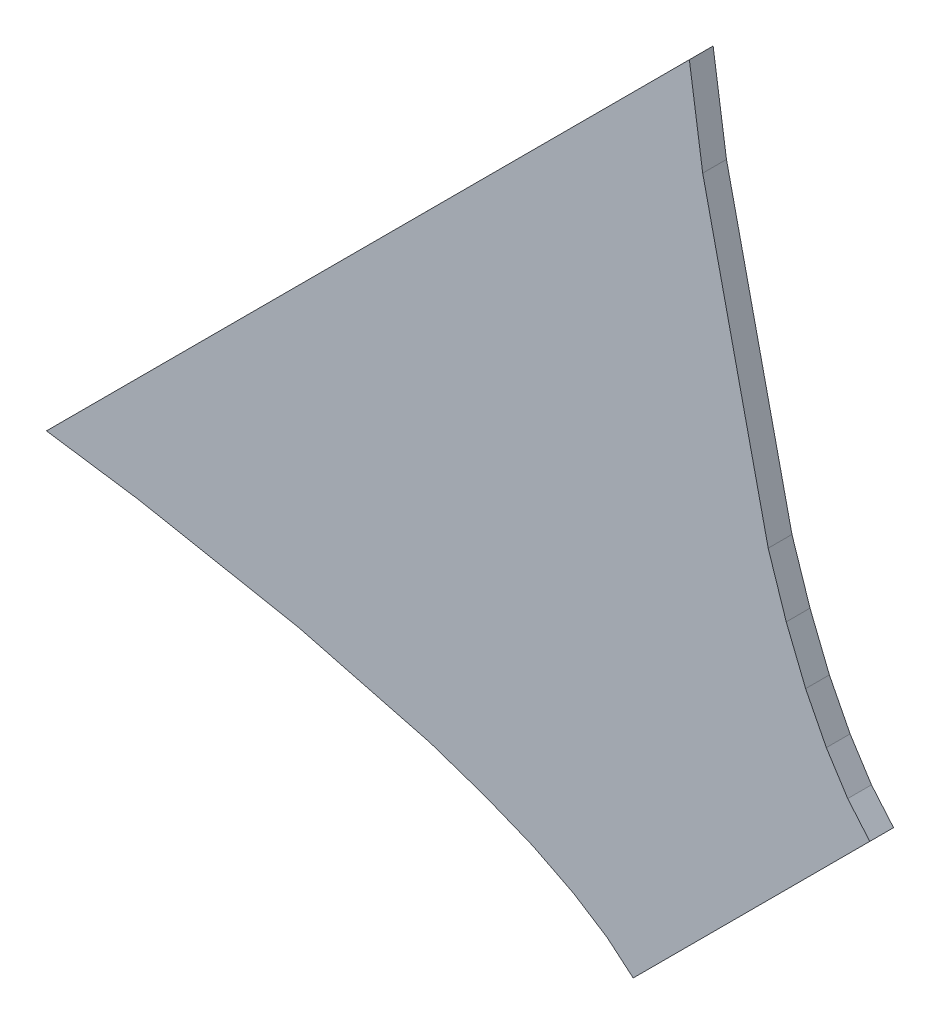
ISO-10303-21;
HEADER;
FILE_DESCRIPTION(('STEP AP214'),'2;1');
FILE_NAME('part.step','',(''),(''),'','','');
FILE_SCHEMA(('AUTOMOTIVE_DESIGN { 1 0 10303 214 1 1 1 1 }'));
ENDSEC;
DATA;
#1=APPLICATION_CONTEXT('core data for automotive mechanical design processes');
#2=APPLICATION_PROTOCOL_DEFINITION('international standard','automotive_design',2000,#1);
#3=PRODUCT_CONTEXT('',#1,'mechanical');
#4=PRODUCT('Part','Part','',(#3));
#5=PRODUCT_RELATED_PRODUCT_CATEGORY('part','',(#4));
#6=PRODUCT_DEFINITION_FORMATION('','',#4);
#7=PRODUCT_DEFINITION_CONTEXT('part definition',#1,'design');
#8=PRODUCT_DEFINITION('design','',#6,#7);
#9=PRODUCT_DEFINITION_SHAPE('','',#8);
#10=(LENGTH_UNIT() NAMED_UNIT(*) SI_UNIT(.MILLI.,.METRE.));
#11=(NAMED_UNIT(*) PLANE_ANGLE_UNIT() SI_UNIT($,.RADIAN.));
#12=(NAMED_UNIT(*) SI_UNIT($,.STERADIAN.) SOLID_ANGLE_UNIT());
#13=UNCERTAINTY_MEASURE_WITH_UNIT(LENGTH_MEASURE(1.E-05),#10,'distance_accuracy_value','');
#14=(GEOMETRIC_REPRESENTATION_CONTEXT(3) GLOBAL_UNCERTAINTY_ASSIGNED_CONTEXT((#13)) GLOBAL_UNIT_ASSIGNED_CONTEXT((#10,
#11,#12)) REPRESENTATION_CONTEXT('',''));
#15=CARTESIAN_POINT('',(0.,0.,0.));
#16=DIRECTION('',(0.,0.,1.));
#17=DIRECTION('',(1.,0.,0.));
#18=AXIS2_PLACEMENT_3D('',#15,#16,#17);
#19=CARTESIAN_POINT('',(86.8219985961914,103.512001037598,0.));
#20=DIRECTION('',(-0.763425936268127,-0.645895378395862,0.));
#21=DIRECTION('',(-0.645895378395862,0.763425936268127,0.));
#22=AXIS2_PLACEMENT_3D('',#19,#20,#21);
#23=PLANE('',#22);
#24=DIRECTION('',(-0.645895378395862,0.763425936268127,0.));
#25=VECTOR('',#24,1.);
#26=CARTESIAN_POINT('',(86.8219985961914,103.512001037598,0.03556));
#27=LINE('',#26,#25);
#28=CARTESIAN_POINT('',(86.8219985961914,103.512001037598,0.03556));
#29=VERTEX_POINT('',#28);
#30=CARTESIAN_POINT('',(86.7890014648438,103.551002502441,0.03556));
#31=VERTEX_POINT('',#30);
#32=EDGE_CURVE('E11',#29,#31,#27,.T.);
#33=ORIENTED_EDGE('',*,*,#32,.F.);
#34=DIRECTION('',(0.,0.,1.));
#35=VECTOR('',#34,1.);
#36=CARTESIAN_POINT('',(86.8219985961914,103.512001037598,0.));
#37=LINE('',#36,#35);
#38=CARTESIAN_POINT('',(86.8219985961914,103.512001037598,0.));
#39=VERTEX_POINT('',#38);
#40=EDGE_CURVE('E24',#39,#29,#37,.T.);
#41=ORIENTED_EDGE('',*,*,#40,.F.);
#42=DIRECTION('',(-0.645895378395862,0.763425936268127,0.));
#43=VECTOR('',#42,1.);
#44=CARTESIAN_POINT('',(86.8219985961914,103.512001037598,0.));
#45=LINE('',#44,#43);
#46=CARTESIAN_POINT('',(86.7890014648438,103.551002502441,0.));
#47=VERTEX_POINT('',#46);
#48=EDGE_CURVE('E154',#39,#47,#45,.T.);
#49=ORIENTED_EDGE('',*,*,#48,.T.);
#50=DIRECTION('',(0.,0.,1.));
#51=VECTOR('',#50,1.);
#52=CARTESIAN_POINT('',(86.7890014648438,103.551002502441,0.));
#53=LINE('',#52,#51);
#54=EDGE_CURVE('E37',#47,#31,#53,.T.);
#55=ORIENTED_EDGE('',*,*,#54,.T.);
#56=EDGE_LOOP('',(#33,#41,#49,#55));
#57=FACE_BOUND('',#56,.T.);
#58=ADVANCED_FACE('F17',(#57),#23,.F.);
#59=CARTESIAN_POINT('',(86.7890014648438,103.551002502441,0.));
#60=DIRECTION('',(-0.842266732063425,-0.539060991038304,0.));
#61=DIRECTION('',(-0.539060991038304,0.842266732063425,0.));
#62=AXIS2_PLACEMENT_3D('',#59,#60,#61);
#63=PLANE('',#62);
#64=DIRECTION('',(-0.539060991038304,0.842266732063425,0.));
#65=VECTOR('',#64,1.);
#66=CARTESIAN_POINT('',(86.7890014648438,103.551002502441,0.03556));
#67=LINE('',#66,#65);
#68=CARTESIAN_POINT('',(86.7570037841797,103.600997924805,0.03556));
#69=VERTEX_POINT('',#68);
#70=EDGE_CURVE('E266',#31,#69,#67,.T.);
#71=ORIENTED_EDGE('',*,*,#70,.F.);
#72=ORIENTED_EDGE('',*,*,#54,.F.);
#73=DIRECTION('',(-0.539060991038304,0.842266732063425,0.));
#74=VECTOR('',#73,1.);
#75=CARTESIAN_POINT('',(86.7890014648438,103.551002502441,0.));
#76=LINE('',#75,#74);
#77=CARTESIAN_POINT('',(86.7570037841797,103.600997924805,0.));
#78=VERTEX_POINT('',#77);
#79=EDGE_CURVE('E263',#47,#78,#76,.T.);
#80=ORIENTED_EDGE('',*,*,#79,.T.);
#81=DIRECTION('',(0.,0.,1.));
#82=VECTOR('',#81,1.);
#83=CARTESIAN_POINT('',(86.7570037841797,103.600997924805,0.));
#84=LINE('',#83,#82);
#85=EDGE_CURVE('E261',#78,#69,#84,.T.);
#86=ORIENTED_EDGE('',*,*,#85,.T.);
#87=EDGE_LOOP('',(#71,#72,#80,#86));
#88=FACE_BOUND('',#87,.T.);
#89=ADVANCED_FACE('F274',(#88),#63,.F.);
#90=CARTESIAN_POINT('',(86.7570037841797,103.600997924805,0.));
#91=DIRECTION('',(-0.891464515087976,-0.453090518924154,0.));
#92=DIRECTION('',(-0.453090518924154,0.891464515087976,0.));
#93=AXIS2_PLACEMENT_3D('',#90,#91,#92);
#94=PLANE('',#93);
#95=DIRECTION('',(-0.453090518924154,0.891464515087976,0.));
#96=VECTOR('',#95,1.);
#97=CARTESIAN_POINT('',(86.7570037841797,103.600997924805,0.03556));
#98=LINE('',#97,#96);
#99=CARTESIAN_POINT('',(86.7259979248047,103.662002563477,0.03556));
#100=VERTEX_POINT('',#99);
#101=EDGE_CURVE('E258',#69,#100,#98,.T.);
#102=ORIENTED_EDGE('',*,*,#101,.F.);
#103=ORIENTED_EDGE('',*,*,#85,.F.);
#104=DIRECTION('',(-0.453090518924154,0.891464515087976,0.));
#105=VECTOR('',#104,1.);
#106=CARTESIAN_POINT('',(86.7570037841797,103.600997924805,0.));
#107=LINE('',#106,#105);
#108=CARTESIAN_POINT('',(86.7259979248047,103.662002563477,0.));
#109=VERTEX_POINT('',#108);
#110=EDGE_CURVE('E255',#78,#109,#107,.T.);
#111=ORIENTED_EDGE('',*,*,#110,.T.);
#112=DIRECTION('',(0.,0.,1.));
#113=VECTOR('',#112,1.);
#114=CARTESIAN_POINT('',(86.7259979248047,103.662002563477,0.));
#115=LINE('',#114,#113);
#116=EDGE_CURVE('E253',#109,#100,#115,.T.);
#117=ORIENTED_EDGE('',*,*,#116,.T.);
#118=EDGE_LOOP('',(#102,#103,#111,#117));
#119=FACE_BOUND('',#118,.T.);
#120=ADVANCED_FACE('F280',(#119),#94,.F.);
#121=CARTESIAN_POINT('',(86.7259979248047,103.662002563477,0.));
#122=DIRECTION('',(-0.927586015125425,-0.373609668696804,0.));
#123=DIRECTION('',(-0.373609668696804,0.927586015125425,0.));
#124=AXIS2_PLACEMENT_3D('',#121,#122,#123);
#125=PLANE('',#124);
#126=DIRECTION('',(-0.373609668696804,0.927586015125425,0.));
#127=VECTOR('',#126,1.);
#128=CARTESIAN_POINT('',(86.7259979248047,103.662002563477,0.03556));
#129=LINE('',#128,#127);
#130=CARTESIAN_POINT('',(86.6969985961914,103.734001159668,0.03556));
#131=VERTEX_POINT('',#130);
#132=EDGE_CURVE('E250',#100,#131,#129,.T.);
#133=ORIENTED_EDGE('',*,*,#132,.F.);
#134=ORIENTED_EDGE('',*,*,#116,.F.);
#135=DIRECTION('',(-0.373609668696804,0.927586015125425,0.));
#136=VECTOR('',#135,1.);
#137=CARTESIAN_POINT('',(86.7259979248047,103.662002563477,0.));
#138=LINE('',#137,#136);
#139=CARTESIAN_POINT('',(86.6969985961914,103.734001159668,0.));
#140=VERTEX_POINT('',#139);
#141=EDGE_CURVE('E247',#109,#140,#138,.T.);
#142=ORIENTED_EDGE('',*,*,#141,.T.);
#143=DIRECTION('',(0.,0.,1.));
#144=VECTOR('',#143,1.);
#145=CARTESIAN_POINT('',(86.6969985961914,103.734001159668,0.));
#146=LINE('',#145,#144);
#147=EDGE_CURVE('E245',#140,#131,#146,.T.);
#148=ORIENTED_EDGE('',*,*,#147,.T.);
#149=EDGE_LOOP('',(#133,#134,#142,#148));
#150=FACE_BOUND('',#149,.T.);
#151=ADVANCED_FACE('F282',(#150),#125,.F.);
#152=CARTESIAN_POINT('',(86.6969985961914,103.734001159668,0.));
#153=DIRECTION('',(-0.949834628983054,-0.312752582059084,0.));
#154=DIRECTION('',(-0.312752582059084,0.949834628983054,0.));
#155=AXIS2_PLACEMENT_3D('',#152,#153,#154);
#156=PLANE('',#155);
#157=DIRECTION('',(-0.312752582059084,0.949834628983054,0.));
#158=VECTOR('',#157,1.);
#159=CARTESIAN_POINT('',(86.6969985961914,103.734001159668,0.03556));
#160=LINE('',#159,#158);
#161=CARTESIAN_POINT('',(86.6699981689453,103.81600189209,0.03556));
#162=VERTEX_POINT('',#161);
#163=EDGE_CURVE('E242',#131,#162,#160,.T.);
#164=ORIENTED_EDGE('',*,*,#163,.F.);
#165=ORIENTED_EDGE('',*,*,#147,.F.);
#166=DIRECTION('',(-0.312752582059084,0.949834628983054,0.));
#167=VECTOR('',#166,1.);
#168=CARTESIAN_POINT('',(86.6969985961914,103.734001159668,0.));
#169=LINE('',#168,#167);
#170=CARTESIAN_POINT('',(86.6699981689453,103.81600189209,0.));
#171=VERTEX_POINT('',#170);
#172=EDGE_CURVE('E239',#140,#171,#169,.T.);
#173=ORIENTED_EDGE('',*,*,#172,.T.);
#174=DIRECTION('',(0.,0.,1.));
#175=VECTOR('',#174,1.);
#176=CARTESIAN_POINT('',(86.6699981689453,103.81600189209,0.));
#177=LINE('',#176,#175);
#178=EDGE_CURVE('E237',#171,#162,#177,.T.);
#179=ORIENTED_EDGE('',*,*,#178,.T.);
#180=EDGE_LOOP('',(#164,#165,#173,#179));
#181=FACE_BOUND('',#180,.T.);
#182=ADVANCED_FACE('F287',(#181),#156,.F.);
#183=CARTESIAN_POINT('',(86.6699981689453,103.81600189209,0.));
#184=DIRECTION('',(-0.975764747850586,-0.218822203745605,0.));
#185=DIRECTION('',(-0.218822203745605,0.975764747850586,0.));
#186=AXIS2_PLACEMENT_3D('',#183,#184,#185);
#187=PLANE('',#186);
#188=DIRECTION('',(-0.218822203745605,0.975764747850586,0.));
#189=VECTOR('',#188,1.);
#190=CARTESIAN_POINT('',(86.6699981689453,103.81600189209,0.03556));
#191=LINE('',#190,#189);
#192=CARTESIAN_POINT('',(86.5719985961914,104.252998352051,0.03556));
#193=VERTEX_POINT('',#192);
#194=EDGE_CURVE('E234',#162,#193,#191,.T.);
#195=ORIENTED_EDGE('',*,*,#194,.F.);
#196=ORIENTED_EDGE('',*,*,#178,.F.);
#197=DIRECTION('',(-0.218822203745605,0.975764747850586,0.));
#198=VECTOR('',#197,1.);
#199=CARTESIAN_POINT('',(86.6699981689453,103.81600189209,0.));
#200=LINE('',#199,#198);
#201=CARTESIAN_POINT('',(86.5719985961914,104.252998352051,0.));
#202=VERTEX_POINT('',#201);
#203=EDGE_CURVE('E231',#171,#202,#200,.T.);
#204=ORIENTED_EDGE('',*,*,#203,.T.);
#205=DIRECTION('',(0.,0.,1.));
#206=VECTOR('',#205,1.);
#207=CARTESIAN_POINT('',(86.5719985961914,104.252998352051,0.));
#208=LINE('',#207,#206);
#209=EDGE_CURVE('E229',#202,#193,#208,.T.);
#210=ORIENTED_EDGE('',*,*,#209,.T.);
#211=EDGE_LOOP('',(#195,#196,#204,#210));
#212=FACE_BOUND('',#211,.T.);
#213=ADVANCED_FACE('F290',(#212),#187,.F.);
#214=CARTESIAN_POINT('',(86.5719985961914,104.252998352051,0.));
#215=DIRECTION('',(-0.989515104847353,-0.144429419714034,0.));
#216=DIRECTION('',(-0.144429419714034,0.989515104847353,0.));
#217=AXIS2_PLACEMENT_3D('',#214,#215,#216);
#218=PLANE('',#217);
#219=DIRECTION('',(-0.144429419714034,0.989515104847353,0.));
#220=VECTOR('',#219,1.);
#221=CARTESIAN_POINT('',(86.5719985961914,104.252998352051,0.03556));
#222=LINE('',#221,#220);
#223=CARTESIAN_POINT('',(86.552001953125,104.389999389648,0.03556));
#224=VERTEX_POINT('',#223);
#225=EDGE_CURVE('E226',#193,#224,#222,.T.);
#226=ORIENTED_EDGE('',*,*,#225,.F.);
#227=ORIENTED_EDGE('',*,*,#209,.F.);
#228=DIRECTION('',(-0.144429419714034,0.989515104847353,0.));
#229=VECTOR('',#228,1.);
#230=CARTESIAN_POINT('',(86.5719985961914,104.252998352051,0.));
#231=LINE('',#230,#229);
#232=CARTESIAN_POINT('',(86.552001953125,104.389999389648,0.));
#233=VERTEX_POINT('',#232);
#234=EDGE_CURVE('E223',#202,#233,#231,.T.);
#235=ORIENTED_EDGE('',*,*,#234,.T.);
#236=DIRECTION('',(0.,0.,1.));
#237=VECTOR('',#236,1.);
#238=CARTESIAN_POINT('',(86.552001953125,104.389999389648,0.));
#239=LINE('',#238,#237);
#240=EDGE_CURVE('E221',#233,#224,#239,.T.);
#241=ORIENTED_EDGE('',*,*,#240,.T.);
#242=EDGE_LOOP('',(#226,#227,#235,#241));
#243=FACE_BOUND('',#242,.T.);
#244=ADVANCED_FACE('F295',(#243),#218,.F.);
#245=CARTESIAN_POINT('',(86.552001953125,104.389999389648,0.));
#246=DIRECTION('',(0.707103977237895,-0.707109585124082,0.));
#247=DIRECTION('',(-0.707109585124082,-0.707103977237895,0.));
#248=AXIS2_PLACEMENT_3D('',#245,#246,#247);
#249=PLANE('',#248);
#250=DIRECTION('',(-0.707109585124082,-0.707103977237895,0.));
#251=VECTOR('',#250,1.);
#252=CARTESIAN_POINT('',(86.552001953125,104.389999389648,0.03556));
#253=LINE('',#252,#251);
#254=CARTESIAN_POINT('',(85.5899963378906,103.428001403809,0.03556));
#255=VERTEX_POINT('',#254);
#256=EDGE_CURVE('E218',#224,#255,#253,.T.);
#257=ORIENTED_EDGE('',*,*,#256,.F.);
#258=ORIENTED_EDGE('',*,*,#240,.F.);
#259=DIRECTION('',(-0.707109585124082,-0.707103977237895,0.));
#260=VECTOR('',#259,1.);
#261=CARTESIAN_POINT('',(86.552001953125,104.389999389648,0.));
#262=LINE('',#261,#260);
#263=CARTESIAN_POINT('',(85.5899963378906,103.428001403809,0.));
#264=VERTEX_POINT('',#263);
#265=EDGE_CURVE('E215',#233,#264,#262,.T.);
#266=ORIENTED_EDGE('',*,*,#265,.T.);
#267=DIRECTION('',(0.,0.,1.));
#268=VECTOR('',#267,1.);
#269=CARTESIAN_POINT('',(85.5899963378906,103.428001403809,0.));
#270=LINE('',#269,#268);
#271=EDGE_CURVE('E213',#264,#255,#270,.T.);
#272=ORIENTED_EDGE('',*,*,#271,.T.);
#273=EDGE_LOOP('',(#257,#258,#266,#272));
#274=FACE_BOUND('',#273,.T.);
#275=ADVANCED_FACE('F298',(#274),#249,.F.);
#276=CARTESIAN_POINT('',(85.5899963378906,103.428001403809,0.));
#277=DIRECTION('',(0.144483374294039,0.989507228145711,0.));
#278=DIRECTION('',(0.989507228145711,-0.144483374294039,0.));
#279=AXIS2_PLACEMENT_3D('',#276,#277,#278);
#280=PLANE('',#279);
#281=DIRECTION('',(0.989507228145711,-0.144483374294039,0.));
#282=VECTOR('',#281,1.);
#283=CARTESIAN_POINT('',(85.5899963378906,103.428001403809,0.03556));
#284=LINE('',#283,#282);
#285=CARTESIAN_POINT('',(85.7269973754883,103.407997131348,0.03556));
#286=VERTEX_POINT('',#285);
#287=EDGE_CURVE('E210',#255,#286,#284,.T.);
#288=ORIENTED_EDGE('',*,*,#287,.F.);
#289=ORIENTED_EDGE('',*,*,#271,.F.);
#290=DIRECTION('',(0.989507228145711,-0.144483374294039,0.));
#291=VECTOR('',#290,1.);
#292=CARTESIAN_POINT('',(85.5899963378906,103.428001403809,0.));
#293=LINE('',#292,#291);
#294=CARTESIAN_POINT('',(85.7269973754883,103.407997131348,0.));
#295=VERTEX_POINT('',#294);
#296=EDGE_CURVE('E207',#264,#295,#293,.T.);
#297=ORIENTED_EDGE('',*,*,#296,.T.);
#298=DIRECTION('',(0.,0.,1.));
#299=VECTOR('',#298,1.);
#300=CARTESIAN_POINT('',(85.7269973754883,103.407997131348,0.));
#301=LINE('',#300,#299);
#302=EDGE_CURVE('E205',#295,#286,#301,.T.);
#303=ORIENTED_EDGE('',*,*,#302,.T.);
#304=EDGE_LOOP('',(#288,#289,#297,#303));
#305=FACE_BOUND('',#304,.T.);
#306=ADVANCED_FACE('F303',(#305),#280,.F.);
#307=CARTESIAN_POINT('',(85.7269973754883,103.407997131348,0.));
#308=DIRECTION('',(0.188226692657996,0.982125609161594,0.));
#309=DIRECTION('',(0.982125609161594,-0.188226692657996,0.));
#310=AXIS2_PLACEMENT_3D('',#307,#308,#309);
#311=PLANE('',#310);
#312=DIRECTION('',(0.982125609161594,-0.188226692657996,0.));
#313=VECTOR('',#312,1.);
#314=CARTESIAN_POINT('',(85.7269973754883,103.407997131348,0.03556));
#315=LINE('',#314,#313);
#316=CARTESIAN_POINT('',(85.9670028686523,103.361999511719,0.03556));
#317=VERTEX_POINT('',#316);
#318=EDGE_CURVE('E202',#286,#317,#315,.T.);
#319=ORIENTED_EDGE('',*,*,#318,.F.);
#320=ORIENTED_EDGE('',*,*,#302,.F.);
#321=DIRECTION('',(0.982125609161594,-0.188226692657996,0.));
#322=VECTOR('',#321,1.);
#323=CARTESIAN_POINT('',(85.7269973754883,103.407997131348,0.));
#324=LINE('',#323,#322);
#325=CARTESIAN_POINT('',(85.9670028686523,103.361999511719,0.));
#326=VERTEX_POINT('',#325);
#327=EDGE_CURVE('E199',#295,#326,#324,.T.);
#328=ORIENTED_EDGE('',*,*,#327,.T.);
#329=DIRECTION('',(0.,0.,1.));
#330=VECTOR('',#329,1.);
#331=CARTESIAN_POINT('',(85.9670028686523,103.361999511719,0.));
#332=LINE('',#331,#330);
#333=EDGE_CURVE('E197',#326,#317,#332,.T.);
#334=ORIENTED_EDGE('',*,*,#333,.T.);
#335=EDGE_LOOP('',(#319,#320,#328,#334));
#336=FACE_BOUND('',#335,.T.);
#337=ADVANCED_FACE('F306',(#336),#311,.F.);
#338=CARTESIAN_POINT('',(85.9670028686523,103.361999511719,0.));
#339=DIRECTION('',(0.250634257741325,0.968081850282534,0.));
#340=DIRECTION('',(0.968081850282534,-0.250634257741325,0.));
#341=AXIS2_PLACEMENT_3D('',#338,#339,#340);
#342=PLANE('',#341);
#343=DIRECTION('',(0.968081850282534,-0.250634257741325,0.));
#344=VECTOR('',#343,1.);
#345=CARTESIAN_POINT('',(85.9670028686523,103.361999511719,0.03556));
#346=LINE('',#345,#344);
#347=CARTESIAN_POINT('',(86.1640014648438,103.310997009277,0.03556));
#348=VERTEX_POINT('',#347);
#349=EDGE_CURVE('E194',#317,#348,#346,.T.);
#350=ORIENTED_EDGE('',*,*,#349,.F.);
#351=ORIENTED_EDGE('',*,*,#333,.F.);
#352=DIRECTION('',(0.968081850282534,-0.250634257741325,0.));
#353=VECTOR('',#352,1.);
#354=CARTESIAN_POINT('',(85.9670028686523,103.361999511719,0.));
#355=LINE('',#354,#353);
#356=CARTESIAN_POINT('',(86.1640014648438,103.310997009277,0.));
#357=VERTEX_POINT('',#356);
#358=EDGE_CURVE('E191',#326,#357,#355,.T.);
#359=ORIENTED_EDGE('',*,*,#358,.T.);
#360=DIRECTION('',(0.,0.,1.));
#361=VECTOR('',#360,1.);
#362=CARTESIAN_POINT('',(86.1640014648438,103.310997009277,0.));
#363=LINE('',#362,#361);
#364=EDGE_CURVE('E189',#357,#348,#363,.T.);
#365=ORIENTED_EDGE('',*,*,#364,.T.);
#366=EDGE_LOOP('',(#350,#351,#359,#365));
#367=FACE_BOUND('',#366,.T.);
#368=ADVANCED_FACE('F311',(#367),#342,.F.);
#369=CARTESIAN_POINT('',(86.1640014648438,103.310997009277,0.));
#370=DIRECTION('',(0.323140006713482,0.946351169524934,0.));
#371=DIRECTION('',(0.946351169524934,-0.323140006713482,0.));
#372=AXIS2_PLACEMENT_3D('',#369,#370,#371);
#373=PLANE('',#372);
#374=DIRECTION('',(0.946351169524934,-0.323140006713482,0.));
#375=VECTOR('',#374,1.);
#376=CARTESIAN_POINT('',(86.1640014648438,103.310997009277,0.03556));
#377=LINE('',#376,#375);
#378=CARTESIAN_POINT('',(86.2460021972656,103.282997131348,0.03556));
#379=VERTEX_POINT('',#378);
#380=EDGE_CURVE('E186',#348,#379,#377,.T.);
#381=ORIENTED_EDGE('',*,*,#380,.F.);
#382=ORIENTED_EDGE('',*,*,#364,.F.);
#383=DIRECTION('',(0.946351169524934,-0.323140006713482,0.));
#384=VECTOR('',#383,1.);
#385=CARTESIAN_POINT('',(86.1640014648438,103.310997009277,0.));
#386=LINE('',#385,#384);
#387=CARTESIAN_POINT('',(86.2460021972656,103.282997131348,0.));
#388=VERTEX_POINT('',#387);
#389=EDGE_CURVE('E183',#357,#388,#386,.T.);
#390=ORIENTED_EDGE('',*,*,#389,.T.);
#391=DIRECTION('',(0.,0.,1.));
#392=VECTOR('',#391,1.);
#393=CARTESIAN_POINT('',(86.2460021972656,103.282997131348,0.));
#394=LINE('',#393,#392);
#395=EDGE_CURVE('E181',#388,#379,#394,.T.);
#396=ORIENTED_EDGE('',*,*,#395,.T.);
#397=EDGE_LOOP('',(#381,#382,#390,#396));
#398=FACE_BOUND('',#397,.T.);
#399=ADVANCED_FACE('F314',(#398),#373,.F.);
#400=CARTESIAN_POINT('',(86.2460021972656,103.282997131348,0.));
#401=DIRECTION('',(0.373609668696804,0.927586015125425,0.));
#402=DIRECTION('',(0.927586015125425,-0.373609668696804,0.));
#403=AXIS2_PLACEMENT_3D('',#400,#401,#402);
#404=PLANE('',#403);
#405=DIRECTION('',(0.927586015125425,-0.373609668696804,0.));
#406=VECTOR('',#405,1.);
#407=CARTESIAN_POINT('',(86.2460021972656,103.282997131348,0.03556));
#408=LINE('',#407,#406);
#409=CARTESIAN_POINT('',(86.318000793457,103.253997802734,0.03556));
#410=VERTEX_POINT('',#409);
#411=EDGE_CURVE('E178',#379,#410,#408,.T.);
#412=ORIENTED_EDGE('',*,*,#411,.F.);
#413=ORIENTED_EDGE('',*,*,#395,.F.);
#414=DIRECTION('',(0.927586015125425,-0.373609668696804,0.));
#415=VECTOR('',#414,1.);
#416=CARTESIAN_POINT('',(86.2460021972656,103.282997131348,0.));
#417=LINE('',#416,#415);
#418=CARTESIAN_POINT('',(86.318000793457,103.253997802734,0.));
#419=VERTEX_POINT('',#418);
#420=EDGE_CURVE('E175',#388,#419,#417,.T.);
#421=ORIENTED_EDGE('',*,*,#420,.T.);
#422=DIRECTION('',(0.,0.,1.));
#423=VECTOR('',#422,1.);
#424=CARTESIAN_POINT('',(86.318000793457,103.253997802734,0.));
#425=LINE('',#424,#423);
#426=EDGE_CURVE('E173',#419,#410,#425,.T.);
#427=ORIENTED_EDGE('',*,*,#426,.T.);
#428=EDGE_LOOP('',(#412,#413,#421,#427));
#429=FACE_BOUND('',#428,.T.);
#430=ADVANCED_FACE('F319',(#429),#404,.F.);
#431=CARTESIAN_POINT('',(86.318000793457,103.253997802734,0.));
#432=DIRECTION('',(0.453046942597137,0.891486661595891,0.));
#433=DIRECTION('',(0.891486661595891,-0.453046942597137,0.));
#434=AXIS2_PLACEMENT_3D('',#431,#432,#433);
#435=PLANE('',#434);
#436=DIRECTION('',(0.891486661595891,-0.453046942597137,0.));
#437=VECTOR('',#436,1.);
#438=CARTESIAN_POINT('',(86.318000793457,103.253997802734,0.03556));
#439=LINE('',#438,#437);
#440=CARTESIAN_POINT('',(86.3789978027344,103.222999572754,0.03556));
#441=VERTEX_POINT('',#440);
#442=EDGE_CURVE('E170',#410,#441,#439,.T.);
#443=ORIENTED_EDGE('',*,*,#442,.F.);
#444=ORIENTED_EDGE('',*,*,#426,.F.);
#445=DIRECTION('',(0.891486661595891,-0.453046942597137,0.));
#446=VECTOR('',#445,1.);
#447=CARTESIAN_POINT('',(86.318000793457,103.253997802734,0.));
#448=LINE('',#447,#446);
#449=CARTESIAN_POINT('',(86.3789978027344,103.222999572754,0.));
#450=VERTEX_POINT('',#449);
#451=EDGE_CURVE('E167',#419,#450,#448,.T.);
#452=ORIENTED_EDGE('',*,*,#451,.T.);
#453=DIRECTION('',(0.,0.,1.));
#454=VECTOR('',#453,1.);
#455=CARTESIAN_POINT('',(86.3789978027344,103.222999572754,0.));
#456=LINE('',#455,#454);
#457=EDGE_CURVE('E165',#450,#441,#456,.T.);
#458=ORIENTED_EDGE('',*,*,#457,.T.);
#459=EDGE_LOOP('',(#443,#444,#452,#458));
#460=FACE_BOUND('',#459,.T.);
#461=ADVANCED_FACE('F322',(#460),#435,.F.);
#462=CARTESIAN_POINT('',(86.3789978027344,103.222999572754,0.));
#463=DIRECTION('',(0.539002638514335,0.842304075541954,0.));
#464=DIRECTION('',(0.842304075541954,-0.539002638514335,0.));
#465=AXIS2_PLACEMENT_3D('',#462,#463,#464);
#466=PLANE('',#465);
#467=DIRECTION('',(0.842304075541954,-0.539002638514335,0.));
#468=VECTOR('',#467,1.);
#469=CARTESIAN_POINT('',(86.3789978027344,103.222999572754,0.03556));
#470=LINE('',#469,#468);
#471=CARTESIAN_POINT('',(86.4290008544922,103.19100189209,0.03556));
#472=VERTEX_POINT('',#471);
#473=EDGE_CURVE('E162',#441,#472,#470,.T.);
#474=ORIENTED_EDGE('',*,*,#473,.F.);
#475=ORIENTED_EDGE('',*,*,#457,.F.);
#476=DIRECTION('',(0.842304075541954,-0.539002638514335,0.));
#477=VECTOR('',#476,1.);
#478=CARTESIAN_POINT('',(86.3789978027344,103.222999572754,0.));
#479=LINE('',#478,#477);
#480=CARTESIAN_POINT('',(86.4290008544922,103.19100189209,0.));
#481=VERTEX_POINT('',#480);
#482=EDGE_CURVE('E160',#450,#481,#479,.T.);
#483=ORIENTED_EDGE('',*,*,#482,.T.);
#484=DIRECTION('',(0.,0.,1.));
#485=VECTOR('',#484,1.);
#486=CARTESIAN_POINT('',(86.4290008544922,103.19100189209,0.));
#487=LINE('',#486,#485);
#488=EDGE_CURVE('E145',#481,#472,#487,.T.);
#489=ORIENTED_EDGE('',*,*,#488,.T.);
#490=EDGE_LOOP('',(#474,#475,#483,#489));
#491=FACE_BOUND('',#490,.T.);
#492=ADVANCED_FACE('F325',(#491),#466,.F.);
#493=CARTESIAN_POINT('',(86.4290008544922,103.19100189209,0.));
#494=DIRECTION('',(0.645982404000613,0.763352299873124,0.));
#495=DIRECTION('',(0.763352299873124,-0.645982404000613,0.));
#496=AXIS2_PLACEMENT_3D('',#493,#494,#495);
#497=PLANE('',#496);
#498=DIRECTION('',(0.763352299873124,-0.645982404000613,0.));
#499=VECTOR('',#498,1.);
#500=CARTESIAN_POINT('',(86.4290008544922,103.19100189209,0.03556));
#501=LINE('',#500,#499);
#502=CARTESIAN_POINT('',(86.4680023193359,103.157997131348,0.03556));
#503=VERTEX_POINT('',#502);
#504=EDGE_CURVE('E149',#472,#503,#501,.T.);
#505=ORIENTED_EDGE('',*,*,#504,.F.);
#506=ORIENTED_EDGE('',*,*,#488,.F.);
#507=DIRECTION('',(0.763352299873124,-0.645982404000613,0.));
#508=VECTOR('',#507,1.);
#509=CARTESIAN_POINT('',(86.4290008544922,103.19100189209,0.));
#510=LINE('',#509,#508);
#511=CARTESIAN_POINT('',(86.4680023193359,103.157997131348,0.));
#512=VERTEX_POINT('',#511);
#513=EDGE_CURVE('E141',#481,#512,#510,.T.);
#514=ORIENTED_EDGE('',*,*,#513,.T.);
#515=DIRECTION('',(0.,0.,1.));
#516=VECTOR('',#515,1.);
#517=CARTESIAN_POINT('',(86.4680023193359,103.157997131348,0.));
#518=LINE('',#517,#516);
#519=EDGE_CURVE('E131',#512,#503,#518,.T.);
#520=ORIENTED_EDGE('',*,*,#519,.T.);
#521=EDGE_LOOP('',(#505,#506,#514,#520));
#522=FACE_BOUND('',#521,.T.);
#523=ADVANCED_FACE('F144',(#522),#497,.F.);
#524=CARTESIAN_POINT('',(86.4680023193359,103.157997131348,0.));
#525=DIRECTION('',(-0.707114400912744,0.707099161378241,0.));
#526=DIRECTION('',(0.707099161378241,0.707114400912744,0.));
#527=AXIS2_PLACEMENT_3D('',#524,#525,#526);
#528=PLANE('',#527);
#529=DIRECTION('',(0.707099161378241,0.707114400912744,0.));
#530=VECTOR('',#529,1.);
#531=CARTESIAN_POINT('',(86.4680023193359,103.157997131348,0.03556));
#532=LINE('',#531,#530);
#533=EDGE_CURVE('E137',#503,#29,#532,.T.);
#534=ORIENTED_EDGE('',*,*,#533,.F.);
#535=ORIENTED_EDGE('',*,*,#519,.F.);
#536=DIRECTION('',(0.707099161378241,0.707114400912744,0.));
#537=VECTOR('',#536,1.);
#538=CARTESIAN_POINT('',(86.4680023193359,103.157997131348,0.));
#539=LINE('',#538,#537);
#540=EDGE_CURVE('E135',#512,#39,#539,.T.);
#541=ORIENTED_EDGE('',*,*,#540,.T.);
#542=ORIENTED_EDGE('',*,*,#40,.T.);
#543=EDGE_LOOP('',(#534,#535,#541,#542));
#544=FACE_BOUND('',#543,.T.);
#545=ADVANCED_FACE('F133',(#544),#528,.F.);
#546=CARTESIAN_POINT('',(86.8219985961914,103.512001037598,0.));
#547=DIRECTION('',(0.,0.,1.));
#548=DIRECTION('',(1.,0.,0.));
#549=AXIS2_PLACEMENT_3D('',#546,#547,#548);
#550=PLANE('',#549);
#551=ORIENTED_EDGE('',*,*,#540,.F.);
#552=ORIENTED_EDGE('',*,*,#513,.F.);
#553=ORIENTED_EDGE('',*,*,#482,.F.);
#554=ORIENTED_EDGE('',*,*,#451,.F.);
#555=ORIENTED_EDGE('',*,*,#420,.F.);
#556=ORIENTED_EDGE('',*,*,#389,.F.);
#557=ORIENTED_EDGE('',*,*,#358,.F.);
#558=ORIENTED_EDGE('',*,*,#327,.F.);
#559=ORIENTED_EDGE('',*,*,#296,.F.);
#560=ORIENTED_EDGE('',*,*,#265,.F.);
#561=ORIENTED_EDGE('',*,*,#234,.F.);
#562=ORIENTED_EDGE('',*,*,#203,.F.);
#563=ORIENTED_EDGE('',*,*,#172,.F.);
#564=ORIENTED_EDGE('',*,*,#141,.F.);
#565=ORIENTED_EDGE('',*,*,#110,.F.);
#566=ORIENTED_EDGE('',*,*,#79,.F.);
#567=ORIENTED_EDGE('',*,*,#48,.F.);
#568=EDGE_LOOP('',(#551,#552,#553,#554,#555,#556,#557,#558,#559,#560,#561,#562,#563,#564,#565,
#566,#567));
#569=FACE_BOUND('',#568,.T.);
#570=ADVANCED_FACE('F152',(#569),#550,.F.);
#571=CARTESIAN_POINT('',(86.8219985961914,103.512001037598,0.03556));
#572=DIRECTION('',(0.,0.,1.));
#573=DIRECTION('',(1.,0.,0.));
#574=AXIS2_PLACEMENT_3D('',#571,#572,#573);
#575=PLANE('',#574);
#576=ORIENTED_EDGE('',*,*,#32,.T.);
#577=ORIENTED_EDGE('',*,*,#70,.T.);
#578=ORIENTED_EDGE('',*,*,#101,.T.);
#579=ORIENTED_EDGE('',*,*,#132,.T.);
#580=ORIENTED_EDGE('',*,*,#163,.T.);
#581=ORIENTED_EDGE('',*,*,#194,.T.);
#582=ORIENTED_EDGE('',*,*,#225,.T.);
#583=ORIENTED_EDGE('',*,*,#256,.T.);
#584=ORIENTED_EDGE('',*,*,#287,.T.);
#585=ORIENTED_EDGE('',*,*,#318,.T.);
#586=ORIENTED_EDGE('',*,*,#349,.T.);
#587=ORIENTED_EDGE('',*,*,#380,.T.);
#588=ORIENTED_EDGE('',*,*,#411,.T.);
#589=ORIENTED_EDGE('',*,*,#442,.T.);
#590=ORIENTED_EDGE('',*,*,#473,.T.);
#591=ORIENTED_EDGE('',*,*,#504,.T.);
#592=ORIENTED_EDGE('',*,*,#533,.T.);
#593=EDGE_LOOP('',(#576,#577,#578,#579,#580,#581,#582,#583,#584,#585,#586,#587,#588,#589,#590,
#591,#592));
#594=FACE_BOUND('',#593,.T.);
#595=ADVANCED_FACE('F277',(#594),#575,.T.);
#596=CLOSED_SHELL('',(#58,#89,#120,#151,#182,#213,#244,#275,#306,#337,#368,#399,#430,#461,#492,
#523,#545,#570,#595));
#597=MANIFOLD_SOLID_BREP('B1',#596);
#598=ADVANCED_BREP_SHAPE_REPRESENTATION('',(#18,#597),#14);
#599=SHAPE_DEFINITION_REPRESENTATION(#9,#598);
ENDSEC;
END-ISO-10303-21;
